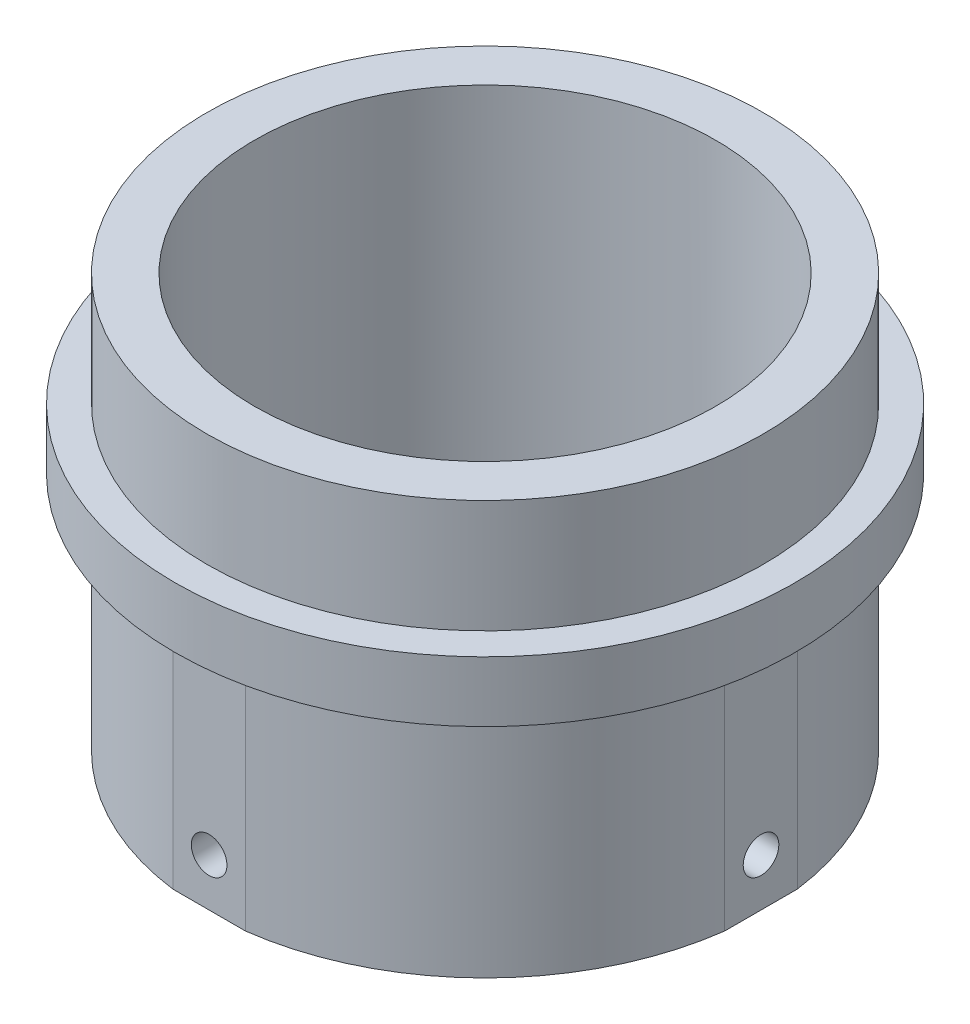
ISO-10303-21;
HEADER;
FILE_DESCRIPTION(('STEP AP214'),'2;1');
FILE_NAME('part.step','',(''),(''),'','','');
FILE_SCHEMA(('AUTOMOTIVE_DESIGN { 1 0 10303 214 1 1 1 1 }'));
ENDSEC;
DATA;
#1=APPLICATION_CONTEXT('core data for automotive mechanical design processes');
#2=APPLICATION_PROTOCOL_DEFINITION('international standard','automotive_design',2000,#1);
#3=PRODUCT_CONTEXT('',#1,'mechanical');
#4=PRODUCT('Part','Part','',(#3));
#5=PRODUCT_RELATED_PRODUCT_CATEGORY('part','',(#4));
#6=PRODUCT_DEFINITION_FORMATION('','',#4);
#7=PRODUCT_DEFINITION_CONTEXT('part definition',#1,'design');
#8=PRODUCT_DEFINITION('design','',#6,#7);
#9=PRODUCT_DEFINITION_SHAPE('','',#8);
#10=(LENGTH_UNIT() NAMED_UNIT(*) SI_UNIT(.MILLI.,.METRE.));
#11=(NAMED_UNIT(*) PLANE_ANGLE_UNIT() SI_UNIT($,.RADIAN.));
#12=(NAMED_UNIT(*) SI_UNIT($,.STERADIAN.) SOLID_ANGLE_UNIT());
#13=UNCERTAINTY_MEASURE_WITH_UNIT(LENGTH_MEASURE(1.E-05),#10,'distance_accuracy_value','');
#14=(GEOMETRIC_REPRESENTATION_CONTEXT(3) GLOBAL_UNCERTAINTY_ASSIGNED_CONTEXT((#13)) GLOBAL_UNIT_ASSIGNED_CONTEXT((#10,
#11,#12)) REPRESENTATION_CONTEXT('',''));
#15=CARTESIAN_POINT('',(0.,0.,0.));
#16=DIRECTION('',(0.,0.,1.));
#17=DIRECTION('',(1.,0.,0.));
#18=AXIS2_PLACEMENT_3D('',#15,#16,#17);
#19=CARTESIAN_POINT('',(0.,33.02,0.));
#20=DIRECTION('',(0.,-1.,0.));
#21=DIRECTION('',(0.,0.,-1.));
#22=AXIS2_PLACEMENT_3D('',#19,#20,#21);
#23=CYLINDRICAL_SURFACE('',#22,22.225);
#24=CARTESIAN_POINT('',(0.,19.177,0.));
#25=DIRECTION('',(0.,1.,0.));
#26=DIRECTION('',(0.,0.,1.));
#27=AXIS2_PLACEMENT_3D('',#24,#25,#26);
#28=CIRCLE('',#27,22.225);
#29=CARTESIAN_POINT('',(2.90369329475419,19.177,22.0345));
#30=VERTEX_POINT('',#29);
#31=CARTESIAN_POINT('',(22.0345,19.177,2.90369329475417));
#32=VERTEX_POINT('',#31);
#33=EDGE_CURVE('E101',#30,#32,#28,.T.);
#34=ORIENTED_EDGE('',*,*,#33,.F.);
#35=DIRECTION('',(0.,-1.,0.));
#36=VECTOR('',#35,1.);
#37=CARTESIAN_POINT('',(2.90369329475419,33.02,22.0345));
#38=LINE('',#37,#36);
#39=CARTESIAN_POINT('',(2.90369329475414,0.,22.0345));
#40=VERTEX_POINT('',#39);
#41=EDGE_CURVE('E104',#40,#30,#38,.F.);
#42=ORIENTED_EDGE('',*,*,#41,.F.);
#43=CARTESIAN_POINT('',(0.,0.,0.));
#44=DIRECTION('',(0.,1.,0.));
#45=DIRECTION('',(0.,0.,1.));
#46=AXIS2_PLACEMENT_3D('',#43,#44,#45);
#47=CIRCLE('',#46,22.225);
#48=CARTESIAN_POINT('',(22.0345,0.,2.90369329475415));
#49=VERTEX_POINT('',#48);
#50=EDGE_CURVE('E41',#40,#49,#47,.T.);
#51=ORIENTED_EDGE('',*,*,#50,.T.);
#52=DIRECTION('',(0.,-1.,0.));
#53=VECTOR('',#52,1.);
#54=CARTESIAN_POINT('',(22.0345,33.02,2.90369329475419));
#55=LINE('',#54,#53);
#56=EDGE_CURVE('E106',#32,#49,#55,.T.);
#57=ORIENTED_EDGE('',*,*,#56,.F.);
#58=EDGE_LOOP('',(#34,#42,#51,#57));
#59=FACE_BOUND('',#58,.T.);
#60=ADVANCED_FACE('F32',(#59),#23,.T.);
#61=CARTESIAN_POINT('',(22.0345,19.177,-2.90369329475417));
#62=VERTEX_POINT('',#61);
#63=CARTESIAN_POINT('',(2.90369329475417,19.177,-22.0345));
#64=VERTEX_POINT('',#63);
#65=EDGE_CURVE('E112',#62,#64,#28,.T.);
#66=ORIENTED_EDGE('',*,*,#65,.F.);
#67=DIRECTION('',(0.,-1.,0.));
#68=VECTOR('',#67,1.);
#69=CARTESIAN_POINT('',(22.0345,33.02,-2.90369329475419));
#70=LINE('',#69,#68);
#71=CARTESIAN_POINT('',(22.0345,0.,-2.90369329475415));
#72=VERTEX_POINT('',#71);
#73=EDGE_CURVE('E126',#72,#62,#70,.F.);
#74=ORIENTED_EDGE('',*,*,#73,.F.);
#75=CARTESIAN_POINT('',(2.90369329475415,0.,-22.0345));
#76=VERTEX_POINT('',#75);
#77=EDGE_CURVE('E167',#72,#76,#47,.T.);
#78=ORIENTED_EDGE('',*,*,#77,.T.);
#79=DIRECTION('',(0.,-1.,0.));
#80=VECTOR('',#79,1.);
#81=CARTESIAN_POINT('',(2.9036932947542,33.02,-22.0345));
#82=LINE('',#81,#80);
#83=EDGE_CURVE('E154',#64,#76,#82,.T.);
#84=ORIENTED_EDGE('',*,*,#83,.F.);
#85=EDGE_LOOP('',(#66,#74,#78,#84));
#86=FACE_BOUND('',#85,.T.);
#87=ADVANCED_FACE('F231',(#86),#23,.T.);
#88=CARTESIAN_POINT('',(-2.90369329475417,19.177,-22.0345));
#89=VERTEX_POINT('',#88);
#90=CARTESIAN_POINT('',(-22.0345,19.177,-2.90369329475417));
#91=VERTEX_POINT('',#90);
#92=EDGE_CURVE('E240',#89,#91,#28,.T.);
#93=ORIENTED_EDGE('',*,*,#92,.F.);
#94=DIRECTION('',(0.,-1.,0.));
#95=VECTOR('',#94,1.);
#96=CARTESIAN_POINT('',(-2.90369329475419,33.02,-22.0345));
#97=LINE('',#96,#95);
#98=CARTESIAN_POINT('',(-2.90369329475414,0.,-22.0345));
#99=VERTEX_POINT('',#98);
#100=EDGE_CURVE('E151',#99,#89,#97,.F.);
#101=ORIENTED_EDGE('',*,*,#100,.F.);
#102=CARTESIAN_POINT('',(-22.0345,0.,-2.90369329475415));
#103=VERTEX_POINT('',#102);
#104=EDGE_CURVE('E229',#99,#103,#47,.T.);
#105=ORIENTED_EDGE('',*,*,#104,.T.);
#106=DIRECTION('',(0.,-1.,0.));
#107=VECTOR('',#106,1.);
#108=CARTESIAN_POINT('',(-22.0345,33.02,-2.90369329475419));
#109=LINE('',#108,#107);
#110=EDGE_CURVE('E57',#91,#103,#109,.T.);
#111=ORIENTED_EDGE('',*,*,#110,.F.);
#112=EDGE_LOOP('',(#93,#101,#105,#111));
#113=FACE_BOUND('',#112,.T.);
#114=ADVANCED_FACE('F247',(#113),#23,.T.);
#115=CARTESIAN_POINT('',(-22.0345,19.177,2.90369329475417));
#116=VERTEX_POINT('',#115);
#117=CARTESIAN_POINT('',(-2.9036932947542,19.177,22.0345));
#118=VERTEX_POINT('',#117);
#119=EDGE_CURVE('E114',#116,#118,#28,.T.);
#120=ORIENTED_EDGE('',*,*,#119,.F.);
#121=DIRECTION('',(0.,-1.,0.));
#122=VECTOR('',#121,1.);
#123=CARTESIAN_POINT('',(-22.0345,33.02,2.90369329475419));
#124=LINE('',#123,#122);
#125=CARTESIAN_POINT('',(-22.0345,0.,2.90369329475415));
#126=VERTEX_POINT('',#125);
#127=EDGE_CURVE('E146',#126,#116,#124,.F.);
#128=ORIENTED_EDGE('',*,*,#127,.F.);
#129=CARTESIAN_POINT('',(-2.90369329475415,0.,22.0345));
#130=VERTEX_POINT('',#129);
#131=EDGE_CURVE('E161',#126,#130,#47,.T.);
#132=ORIENTED_EDGE('',*,*,#131,.T.);
#133=DIRECTION('',(0.,-1.,0.));
#134=VECTOR('',#133,1.);
#135=CARTESIAN_POINT('',(-2.9036932947542,33.02,22.0345));
#136=LINE('',#135,#134);
#137=EDGE_CURVE('E49',#118,#130,#136,.T.);
#138=ORIENTED_EDGE('',*,*,#137,.F.);
#139=EDGE_LOOP('',(#120,#128,#132,#138));
#140=FACE_BOUND('',#139,.T.);
#141=ADVANCED_FACE('F237',(#140),#23,.T.);
#142=CARTESIAN_POINT('',(0.,24.003,0.));
#143=DIRECTION('',(0.,1.,0.));
#144=DIRECTION('',(0.,0.,1.));
#145=AXIS2_PLACEMENT_3D('',#142,#143,#144);
#146=CIRCLE('',#145,22.225);
#147=CARTESIAN_POINT('',(0.,24.003,22.225));
#148=VERTEX_POINT('',#147);
#149=EDGE_CURVE('E111',#148,#148,#146,.T.);
#150=ORIENTED_EDGE('',*,*,#149,.T.);
#151=EDGE_LOOP('',(#150));
#152=FACE_BOUND('',#151,.T.);
#153=CARTESIAN_POINT('',(0.,33.02,0.));
#154=DIRECTION('',(0.,1.,0.));
#155=DIRECTION('',(0.,0.,1.));
#156=AXIS2_PLACEMENT_3D('',#153,#154,#155);
#157=CIRCLE('',#156,22.225);
#158=CARTESIAN_POINT('',(0.,33.02,22.225));
#159=VERTEX_POINT('',#158);
#160=EDGE_CURVE('E11',#159,#159,#157,.T.);
#161=ORIENTED_EDGE('',*,*,#160,.F.);
#162=EDGE_LOOP('',(#161));
#163=FACE_BOUND('',#162,.T.);
#164=ADVANCED_FACE('F34',(#152,#163),#23,.T.);
#165=CARTESIAN_POINT('',(0.,0.,0.));
#166=DIRECTION('',(0.,1.,0.));
#167=DIRECTION('',(0.,0.,1.));
#168=AXIS2_PLACEMENT_3D('',#165,#166,#167);
#169=PLANE('',#168);
#170=CARTESIAN_POINT('',(0.,0.,0.));
#171=DIRECTION('',(0.,1.,0.));
#172=DIRECTION('',(0.,0.,1.));
#173=AXIS2_PLACEMENT_3D('',#170,#171,#172);
#174=CIRCLE('',#173,18.415);
#175=CARTESIAN_POINT('',(0.,0.,18.415));
#176=VERTEX_POINT('',#175);
#177=EDGE_CURVE('E162',#176,#176,#174,.T.);
#178=ORIENTED_EDGE('',*,*,#177,.T.);
#179=EDGE_LOOP('',(#178));
#180=FACE_BOUND('',#179,.T.);
#181=DIRECTION('',(0.,0.,-1.));
#182=VECTOR('',#181,1.);
#183=CARTESIAN_POINT('',(-22.0345,0.,-22.0345));
#184=LINE('',#183,#182);
#185=EDGE_CURVE('E132',#126,#103,#184,.T.);
#186=ORIENTED_EDGE('',*,*,#185,.T.);
#187=ORIENTED_EDGE('',*,*,#104,.F.);
#188=DIRECTION('',(1.,0.,0.));
#189=VECTOR('',#188,1.);
#190=CARTESIAN_POINT('',(22.0345,0.,-22.0345));
#191=LINE('',#190,#189);
#192=EDGE_CURVE('E134',#99,#76,#191,.T.);
#193=ORIENTED_EDGE('',*,*,#192,.T.);
#194=ORIENTED_EDGE('',*,*,#77,.F.);
#195=DIRECTION('',(0.,0.,1.));
#196=VECTOR('',#195,1.);
#197=CARTESIAN_POINT('',(22.0345,0.,-22.0345));
#198=LINE('',#197,#196);
#199=EDGE_CURVE('E137',#72,#49,#198,.T.);
#200=ORIENTED_EDGE('',*,*,#199,.T.);
#201=ORIENTED_EDGE('',*,*,#50,.F.);
#202=DIRECTION('',(-1.,0.,0.));
#203=VECTOR('',#202,1.);
#204=CARTESIAN_POINT('',(22.0345,0.,22.0345));
#205=LINE('',#204,#203);
#206=EDGE_CURVE('E117',#40,#130,#205,.T.);
#207=ORIENTED_EDGE('',*,*,#206,.T.);
#208=ORIENTED_EDGE('',*,*,#131,.F.);
#209=EDGE_LOOP('',(#186,#187,#193,#194,#200,#201,#207,#208));
#210=FACE_BOUND('',#209,.T.);
#211=ADVANCED_FACE('F189',(#180,#210),#169,.F.);
#212=CARTESIAN_POINT('',(0.,3.81,43.18));
#213=DIRECTION('',(0.,0.,-1.));
#214=DIRECTION('',(-1.,0.,0.));
#215=AXIS2_PLACEMENT_3D('',#212,#213,#214);
#216=CYLINDRICAL_SURFACE('',#215,1.4224);
#217=CARTESIAN_POINT('',(-1.4224,3.81,18.3599837483588));
#218=CARTESIAN_POINT('',(-1.42239650681355,3.73023113459155,18.35998447961));
#219=CARTESIAN_POINT('',(-1.41566721976569,3.65040746469429,18.3605092022995));
#220=CARTESIAN_POINT('',(-1.38892106447783,3.49296729513801,18.3625514626492));
#221=CARTESIAN_POINT('',(-1.36888900820476,3.41535342420208,18.3640701350928));
#222=CARTESIAN_POINT('',(-1.31611884052771,3.26463599228246,18.3679272630427));
#223=CARTESIAN_POINT('',(-1.28338777263925,3.19152995702923,18.3702652640385));
#224=CARTESIAN_POINT('',(-1.20616087485778,3.05186749628802,18.3754970431409));
#225=CARTESIAN_POINT('',(-1.16166761755281,2.98530964296546,18.3783906996786));
#226=CARTESIAN_POINT('',(-1.06207204281324,2.86046686881619,18.3844149862797));
#227=CARTESIAN_POINT('',(-1.00694899697167,2.80219850497902,18.3875460719777));
#228=CARTESIAN_POINT('',(-0.887702199123555,2.69573083522692,18.3936882309961));
#229=CARTESIAN_POINT('',(-0.823578059883515,2.64753196273084,18.3966992991461));
#230=CARTESIAN_POINT('',(-0.688051891605246,2.56251742801623,18.4022663776143));
#231=CARTESIAN_POINT('',(-0.616640949387226,2.52571593439697,18.4048218198629));
#232=CARTESIAN_POINT('',(-0.468630543431606,2.46463145986177,18.4091848323384));
#233=CARTESIAN_POINT('',(-0.392031159152555,2.44034828728264,18.4109924140153));
#234=CARTESIAN_POINT('',(-0.235981761047581,2.40503699386494,18.4136528634299));
#235=CARTESIAN_POINT('',(-0.156537794976674,2.39398229298813,18.4145076453954));
#236=CARTESIAN_POINT('',(0.00308233241536438,2.38535960350556,18.4151726603184));
#237=CARTESIAN_POINT('',(0.0832584818234071,2.38779139585492,18.414982910241));
#238=CARTESIAN_POINT('',(0.241886905298073,2.40605086871976,18.4135818255302));
#239=CARTESIAN_POINT('',(0.320342491643396,2.42184996445918,18.4123726708215));
#240=CARTESIAN_POINT('',(0.473484864874059,2.46635114688757,18.4090713275997));
#241=CARTESIAN_POINT('',(0.548171620205863,2.49505334158438,18.4069791316949));
#242=CARTESIAN_POINT('',(0.691747472087647,2.56457799512987,18.4021433879079));
#243=CARTESIAN_POINT('',(0.760630321600572,2.60541330484426,18.3993991500319));
#244=CARTESIAN_POINT('',(0.890574837745808,2.69803568951046,18.3935678616803));
#245=CARTESIAN_POINT('',(0.951636368414656,2.74982295480631,18.3904808052469));
#246=CARTESIAN_POINT('',(1.06437197169305,2.86304041424669,18.3843014569731));
#247=CARTESIAN_POINT('',(1.11602111252135,2.92449543771333,18.3812091725137));
#248=CARTESIAN_POINT('',(1.20827331598365,3.05521725525148,18.3753760254579));
#249=CARTESIAN_POINT('',(1.24887637126222,3.1244840545247,18.3726351630954));
#250=CARTESIAN_POINT('',(1.3178826176913,3.26888016715358,18.3678145931863));
#251=CARTESIAN_POINT('',(1.34628459350678,3.34401006364504,18.3657349515085));
#252=CARTESIAN_POINT('',(1.39006439710553,3.49799170911758,18.3624734748677));
#253=CARTESIAN_POINT('',(1.40544245969007,3.57684339097349,18.3612916237191));
#254=CARTESIAN_POINT('',(1.4227065096175,3.73581235624515,18.3599620776445));
#255=CARTESIAN_POINT('',(1.42462722887299,3.81592584645773,18.3598117205675));
#256=CARTESIAN_POINT('',(1.41501297476957,3.97533580674621,18.3605551556612));
#257=CARTESIAN_POINT('',(1.4034781089956,4.05463228334949,18.3614489394833));
#258=CARTESIAN_POINT('',(1.3673090387285,4.21005805409689,18.364177516596));
#259=CARTESIAN_POINT('',(1.34269097430839,4.28619112627028,18.3660111503429));
#260=CARTESIAN_POINT('',(1.28107071090154,4.43324584747155,18.3704118468304));
#261=CARTESIAN_POINT('',(1.24406834081255,4.5041674244806,18.3729789197042));
#262=CARTESIAN_POINT('',(1.15864166095174,4.63894508415851,18.3785636959021));
#263=CARTESIAN_POINT('',(1.11019416539979,4.70278643261314,18.3815823093527));
#264=CARTESIAN_POINT('',(1.00328604980187,4.82144265548429,18.3877269224582));
#265=CARTESIAN_POINT('',(0.944825281467274,4.87625739620031,18.3908529237029));
#266=CARTESIAN_POINT('',(0.819400212243705,4.97542257088513,18.3968679678259));
#267=CARTESIAN_POINT('',(0.752418064576355,5.01975046785939,18.3997564918161));
#268=CARTESIAN_POINT('',(0.611940796135872,5.09652915173432,18.4049636525005));
#269=CARTESIAN_POINT('',(0.538445732527976,5.12898004286916,18.407282294196));
#270=CARTESIAN_POINT('',(0.387110316777364,5.18104468703538,18.4110860294673));
#271=CARTESIAN_POINT('',(0.309274819173709,5.20067248140924,18.4125720345288));
#272=CARTESIAN_POINT('',(0.151401128933423,5.22657968233437,18.4145467459462));
#273=CARTESIAN_POINT('',(0.0713629715564833,5.23285930243452,18.4150354682569));
#274=CARTESIAN_POINT('',(-0.0884216203845036,5.23188955907571,18.4149605817495));
#275=CARTESIAN_POINT('',(-0.168168272038826,5.22467536436163,18.4143997084762));
#276=CARTESIAN_POINT('',(-0.325313957645529,5.1969959812794,18.4122940786297));
#277=CARTESIAN_POINT('',(-0.402712988062591,5.17653077295738,18.4107493205749));
#278=CARTESIAN_POINT('',(-0.552969531289386,5.12293894364712,18.4068493371571));
#279=CARTESIAN_POINT('',(-0.62582721995756,5.08981281329382,18.4044941432003));
#280=CARTESIAN_POINT('',(-0.764952449259312,5.01184368019842,18.3992370795251));
#281=CARTESIAN_POINT('',(-0.831220115404544,4.96700090066725,18.3963352202214));
#282=CARTESIAN_POINT('',(-0.955463898009027,4.8667396705029,18.3903017597444));
#283=CARTESIAN_POINT('',(-1.01341908129818,4.81129531298266,18.3871696075945));
#284=CARTESIAN_POINT('',(-1.11922260308531,4.69144908972928,18.3810332238005));
#285=CARTESIAN_POINT('',(-1.16706848254594,4.62704505090236,18.3780290234216));
#286=CARTESIAN_POINT('',(-1.25135036997888,4.49099944783212,18.3724832216959));
#287=CARTESIAN_POINT('',(-1.2877672310005,4.41934600140765,18.3699423995942));
#288=CARTESIAN_POINT('',(-1.34800716001514,4.27097190660863,18.3656206611829));
#289=CARTESIAN_POINT('',(-1.37184479450424,4.19425723540773,18.3638388663977));
#290=CARTESIAN_POINT('',(-1.40013822045773,4.0659037034883,18.3616979890394));
#291=CARTESIAN_POINT('',(-1.40847538850035,4.01509176465998,18.3610580771666));
#292=CARTESIAN_POINT('',(-1.41960739839332,3.91286081363068,18.3602007215145));
#293=CARTESIAN_POINT('',(-1.42240225270609,3.86144180279502,18.3599832767854));
#294=CARTESIAN_POINT('',(-1.4224,3.81,18.3599837483588));
#295=B_SPLINE_CURVE_WITH_KNOTS('',3,(#217,#218,#219,#220,#221,#222,#223,#224,#225,#226,#227,
#228,#229,#230,#231,#232,#233,#234,#235,#236,#237,#238,#239,#240,#241,#242,#243,#244,#245,#246,
#247,#248,#249,#250,#251,#252,#253,#254,#255,#256,#257,#258,#259,#260,#261,#262,#263,#264,#265,
#266,#267,#268,#269,#270,#271,#272,#273,#274,#275,#276,#277,#278,#279,#280,#281,#282,#283,#284,
#285,#286,#287,#288,#289,#290,#291,#292,#293,#294),.UNSPECIFIED.,.T.,.F.,(4,2,2,2,2,2,2,2,2,2,2,
2,2,2,2,2,2,2,2,2,2,2,2,2,2,2,2,2,2,2,2,2,2,2,2,2,2,2,4),(0.,0.239118782158438,
0.478511041381392,0.717770710905918,0.956978093562213,1.19665674301657,1.43634570678035,
1.67633145368428,1.91631352614997,2.15581258732235,2.39530775861114,2.63429208164904,
2.87327840518791,3.11251876043804,3.35176327400661,3.59163257459823,3.83150203491485,
4.07139538280642,4.31128440569505,4.55055407276404,4.78982182675119,5.02879509120597,
5.26777165746519,5.5072365630995,5.74670501532593,5.98668352040625,6.22665991935319,
6.46637310077815,6.7060824471568,6.94516791271504,7.18425373829788,7.42333029978715,
7.66240230702126,7.90206617428451,8.14178827163478,8.38190985593974,8.62175277062241,
8.77595740714041,8.9301616969143),.UNSPECIFIED.);
#296=CARTESIAN_POINT('',(-1.4224,3.81,18.3599837483588));
#297=VERTEX_POINT('',#296);
#298=EDGE_CURVE('E168',#297,#297,#295,.T.);
#299=ORIENTED_EDGE('',*,*,#298,.F.);
#300=EDGE_LOOP('',(#299));
#301=FACE_BOUND('',#300,.T.);
#302=CARTESIAN_POINT('',(0.,3.81,22.0345));
#303=DIRECTION('',(0.,0.,1.));
#304=DIRECTION('',(1.,0.,0.));
#305=AXIS2_PLACEMENT_3D('',#302,#303,#304);
#306=CIRCLE('',#305,1.4224);
#307=CARTESIAN_POINT('',(1.4224,3.81,22.0345));
#308=VERTEX_POINT('',#307);
#309=EDGE_CURVE('E36',#308,#308,#306,.T.);
#310=ORIENTED_EDGE('',*,*,#309,.T.);
#311=EDGE_LOOP('',(#310));
#312=FACE_BOUND('',#311,.T.);
#313=ADVANCED_FACE('F184',(#301,#312),#216,.F.);
#314=CARTESIAN_POINT('',(0.,5.2324,-18.415));
#315=CARTESIAN_POINT('',(0.079769265670183,5.23239650717487,-18.4149992768214));
#316=CARTESIAN_POINT('',(0.159593334513902,5.2256671548785,-18.4144761575236));
#317=CARTESIAN_POINT('',(0.317034333004277,5.19892071684706,-18.4124396257413));
#318=CARTESIAN_POINT('',(0.394648634240625,5.17888844444777,-18.4109250814705));
#319=CARTESIAN_POINT('',(0.545366975877828,5.12611764448406,-18.407076910129));
#320=CARTESIAN_POINT('',(0.618473486903995,5.09338615014054,-18.4047437365088));
#321=CARTESIAN_POINT('',(0.758136744219959,5.01615824820884,-18.3995202048964));
#322=CARTESIAN_POINT('',(0.824694918942588,4.97166441426177,-18.3966299688288));
#323=CARTESIAN_POINT('',(0.949537327675537,4.87206825807139,-18.3906096663636));
#324=CARTESIAN_POINT('',(1.00780510709163,4.81694533614833,-18.387479141484));
#325=CARTESIAN_POINT('',(1.11427164961792,4.69769903118218,-18.3813349575124));
#326=CARTESIAN_POINT('',(1.16246997751785,4.63357525931487,-18.3783213034761));
#327=CARTESIAN_POINT('',(1.24748394469796,4.49804941043927,-18.3727470090641));
#328=CARTESIAN_POINT('',(1.28428531481542,4.42663835709678,-18.3701869382826));
#329=CARTESIAN_POINT('',(1.34536953033033,4.27862770954702,-18.3658146868665));
#330=CARTESIAN_POINT('',(1.36965256887147,4.20202819541246,-18.3640024946931));
#331=CARTESIAN_POINT('',(1.4049635793129,4.04597840983168,-18.3613348790882));
#332=CARTESIAN_POINT('',(1.41601812051501,3.96653418381303,-18.3604775380889));
#333=CARTESIAN_POINT('',(1.42464040059368,3.80691354819573,-18.3598105759478));
#334=CARTESIAN_POINT('',(1.42220836022101,3.72673715060285,-18.360000937657));
#335=CARTESIAN_POINT('',(1.40394849681943,3.56810982669967,-18.3614061354453));
#336=CARTESIAN_POINT('',(1.38814950817211,3.48965555895466,-18.3626187663264));
#337=CARTESIAN_POINT('',(1.34364899782897,3.33651576770772,-18.3659283997654));
#338=CARTESIAN_POINT('',(1.31494736572265,3.26183027646206,-18.3680254098911));
#339=CARTESIAN_POINT('',(1.24542387263419,3.1182559485861,-18.3728700488496));
#340=CARTESIAN_POINT('',(1.20458902879177,3.04937342313827,-18.3756183739658));
#341=CARTESIAN_POINT('',(1.11196763607319,2.91942935712147,-18.3814553020504));
#342=CARTESIAN_POINT('',(1.06018089711768,2.85836795232415,-18.3845439109242));
#343=CARTESIAN_POINT('',(0.946963808363313,2.74563174651247,-18.3907231868548));
#344=CARTESIAN_POINT('',(0.885508522460619,2.69398198378256,-18.3938138380644));
#345=CARTESIAN_POINT('',(0.754785959232194,2.60172865098595,-18.3996412051402));
#346=CARTESIAN_POINT('',(0.685518677600247,2.5611250870083,-18.4023779208113));
#347=CARTESIAN_POINT('',(0.541122439954809,2.49211847562865,-18.4071894709376));
#348=CARTESIAN_POINT('',(0.465992976654934,2.46371648548166,-18.4092642480326));
#349=CARTESIAN_POINT('',(0.312012271930564,2.41993652022416,-18.4125174556561));
#350=CARTESIAN_POINT('',(0.233161096888662,2.40455831290656,-18.4136959021658));
#351=CARTESIAN_POINT('',(0.0741923583750264,2.38729371792451,-18.4150216142314));
#352=CARTESIAN_POINT('',(-0.00592142684414351,2.38537273514898,-18.4151715238743));
#353=CARTESIAN_POINT('',(-0.16533204065434,2.3949865675319,-18.414430323687));
#354=CARTESIAN_POINT('',(-0.244628875772769,2.40652127509561,-18.4135392221809));
#355=CARTESIAN_POINT('',(-0.400056384229214,2.44269039582758,-18.4108179468935));
#356=CARTESIAN_POINT('',(-0.476190798666664,2.46730882605144,-18.4089889189692));
#357=CARTESIAN_POINT('',(-0.623248042317289,2.52893027117141,-18.404597353445));
#358=CARTESIAN_POINT('',(-0.694170800415973,2.56593345502266,-18.4020348058384));
#359=CARTESIAN_POINT('',(-0.828949250989163,2.65136132479489,-18.3964570838456));
#360=CARTESIAN_POINT('',(-0.892790340484276,2.69980898958106,-18.3934410033174));
#361=CARTESIAN_POINT('',(-1.01144596191247,2.80671729526664,-18.3872983055757));
#362=CARTESIAN_POINT('',(-1.06626035902624,2.86517808569175,-18.3841716867121));
#363=CARTESIAN_POINT('',(-1.16542481093598,2.99060300206489,-18.3781525236131));
#364=CARTESIAN_POINT('',(-1.2097523324711,3.0575849714334,-18.3752604920384));
#365=CARTESIAN_POINT('',(-1.28653035722479,3.19806178503782,-18.3700449596842));
#366=CARTESIAN_POINT('',(-1.31898096461401,3.27155657214374,-18.3677214539184));
#367=CARTESIAN_POINT('',(-1.37104541675742,3.42289217843935,-18.3639087584445));
#368=CARTESIAN_POINT('',(-1.390673179994,3.50072818550095,-18.3624186643682));
#369=CARTESIAN_POINT('',(-1.41658014594613,3.65860294860316,-18.3604383701137));
#370=CARTESIAN_POINT('',(-1.42285956491921,3.73864166893616,-18.3599481537364));
#371=CARTESIAN_POINT('',(-1.42188924319078,3.89842589991751,-18.3600233089485));
#372=CARTESIAN_POINT('',(-1.41467491223953,3.97817162929706,-18.3605859177587));
#373=CARTESIAN_POINT('',(-1.38699558151394,4.13531543682674,-18.3626974655877));
#374=CARTESIAN_POINT('',(-1.36653056014379,4.21271351115048,-18.364246406214));
#375=CARTESIAN_POINT('',(-1.31293945623939,4.36296816770446,-18.368155372484));
#376=CARTESIAN_POINT('',(-1.27981386875591,4.43582492737869,-18.3705153664137));
#377=CARTESIAN_POINT('',(-1.20184610832818,4.57494852582574,-18.3757805526126));
#378=CARTESIAN_POINT('',(-1.15700415757706,4.64121548953679,-18.3786857345424));
#379=CARTESIAN_POINT('',(-1.05674382964918,4.76545933534105,-18.3847229734294));
#380=CARTESIAN_POINT('',(-1.00129935669293,4.82341513221047,-18.387855578083));
#381=CARTESIAN_POINT('',(-0.881452651408993,4.92921983793809,-18.393989738219));
#382=CARTESIAN_POINT('',(-0.817048247340197,4.97706628935274,-18.3969912616971));
#383=CARTESIAN_POINT('',(-0.681002356095281,5.06134878166766,-18.4025297187673));
#384=CARTESIAN_POINT('',(-0.60934905210392,5.09776578118259,-18.4050658741712));
#385=CARTESIAN_POINT('',(-0.460975261292935,5.15800600876764,-18.4093783823736));
#386=CARTESIAN_POINT('',(-0.384260750787909,5.18184380130877,-18.4111556134137));
#387=CARTESIAN_POINT('',(-0.255906794806871,5.21013767964626,-18.4132907177239));
#388=CARTESIAN_POINT('',(-0.205094239219609,5.21847505116115,-18.4139288029928));
#389=CARTESIAN_POINT('',(-0.102862052098104,5.22960733141506,-18.4147836768475));
#390=CARTESIAN_POINT('',(-0.0514424219151734,5.23240225248888,-18.4150004663708));
#391=CARTESIAN_POINT('',(0.,5.2324,-18.415));
#392=B_SPLINE_CURVE_WITH_KNOTS('',3,(#314,#315,#316,#317,#318,#319,#320,#321,#322,#323,#324,
#325,#326,#327,#328,#329,#330,#331,#332,#333,#334,#335,#336,#337,#338,#339,#340,#341,#342,#343,
#344,#345,#346,#347,#348,#349,#350,#351,#352,#353,#354,#355,#356,#357,#358,#359,#360,#361,#362,
#363,#364,#365,#366,#367,#368,#369,#370,#371,#372,#373,#374,#375,#376,#377,#378,#379,#380,#381,
#382,#383,#384,#385,#386,#387,#388,#389,#390,#391),.UNSPECIFIED.,.T.,.F.,(4,2,2,2,2,2,2,2,2,2,2,
2,2,2,2,2,2,2,2,2,2,2,2,2,2,2,2,2,2,2,2,2,2,2,2,2,2,2,4),(0.,0.239119984341714,
0.478513419326219,0.717774459665111,0.956983192117747,1.19666026864117,1.43634770206977,
1.67633402575237,1.91631664660671,2.1558164514475,2.39531233612436,2.63429290793643,
2.87327552479219,3.11251478601091,3.35175819976867,3.59162907783054,3.83150008811735,
4.07139187881382,4.31127939227806,4.55054998873371,4.78981867194095,5.02879573650551,
5.26777606137285,5.50724036506742,5.74670824498729,5.98668609130349,6.2266618327591,
6.4663766592268,6.70608760202677,6.94517038748361,7.18425356259553,7.42332739008409,
7.66239668402385,7.90206214959617,8.14178580770595,8.38190674936738,8.62174906054022,
8.77595555091583,8.93016169810184),.UNSPECIFIED.);
#393=CARTESIAN_POINT('',(0.,5.2324,-18.415));
#394=VERTEX_POINT('',#393);
#395=EDGE_CURVE('E164',#394,#394,#392,.T.);
#396=ORIENTED_EDGE('',*,*,#395,.F.);
#397=EDGE_LOOP('',(#396));
#398=FACE_BOUND('',#397,.T.);
#399=CARTESIAN_POINT('',(0.,3.81,-22.0345));
#400=DIRECTION('',(0.,0.,-1.));
#401=DIRECTION('',(-1.,0.,0.));
#402=AXIS2_PLACEMENT_3D('',#399,#400,#401);
#403=CIRCLE('',#402,1.4224);
#404=CARTESIAN_POINT('',(-1.4224,3.81,-22.0345));
#405=VERTEX_POINT('',#404);
#406=EDGE_CURVE('E150',#405,#405,#403,.T.);
#407=ORIENTED_EDGE('',*,*,#406,.T.);
#408=EDGE_LOOP('',(#407));
#409=FACE_BOUND('',#408,.T.);
#410=ADVANCED_FACE('F188',(#398,#409),#216,.F.);
#411=CARTESIAN_POINT('',(43.18,3.81,0.));
#412=DIRECTION('',(-1.,0.,0.));
#413=DIRECTION('',(0.,0.,1.));
#414=AXIS2_PLACEMENT_3D('',#411,#412,#413);
#415=CYLINDRICAL_SURFACE('',#414,1.4224);
#416=CARTESIAN_POINT('',(-18.3599837483588,3.81,1.4224));
#417=CARTESIAN_POINT('',(-18.35998447961,3.88976886540845,1.42239650681355));
#418=CARTESIAN_POINT('',(-18.3605092022995,3.96959253530571,1.41566721976569));
#419=CARTESIAN_POINT('',(-18.3625514626492,4.12703270486199,1.38892106447783));
#420=CARTESIAN_POINT('',(-18.3640701350928,4.20464657579792,1.36888900820476));
#421=CARTESIAN_POINT('',(-18.3679272630427,4.35536400771754,1.31611884052771));
#422=CARTESIAN_POINT('',(-18.3702652640385,4.42847004297077,1.28338777263925));
#423=CARTESIAN_POINT('',(-18.3754970431409,4.56813250371198,1.20616087485778));
#424=CARTESIAN_POINT('',(-18.3783906996786,4.63469035703454,1.16166761755281));
#425=CARTESIAN_POINT('',(-18.3844149862797,4.75953313118381,1.06207204281324));
#426=CARTESIAN_POINT('',(-18.3875460719777,4.81780149502098,1.00694899697167));
#427=CARTESIAN_POINT('',(-18.3936882309961,4.92426916477308,0.887702199123555));
#428=CARTESIAN_POINT('',(-18.3966992991461,4.97246803726916,0.823578059883514));
#429=CARTESIAN_POINT('',(-18.4022663776143,5.05748257198377,0.688051891605246));
#430=CARTESIAN_POINT('',(-18.4048218198629,5.09428406560302,0.616640949387226));
#431=CARTESIAN_POINT('',(-18.4091848323384,5.15536854013823,0.468630543431606));
#432=CARTESIAN_POINT('',(-18.4109924140153,5.17965171271736,0.392031159152555));
#433=CARTESIAN_POINT('',(-18.4136528634299,5.21496300613506,0.235981761047581));
#434=CARTESIAN_POINT('',(-18.4145076453954,5.22601770701186,0.156537794976674));
#435=CARTESIAN_POINT('',(-18.4151726603184,5.23464039649444,-0.00308233241536477));
#436=CARTESIAN_POINT('',(-18.414982910241,5.23220860414508,-0.0832584818234076));
#437=CARTESIAN_POINT('',(-18.4135818255302,5.21394913128024,-0.241886905298074));
#438=CARTESIAN_POINT('',(-18.4123726708215,5.19815003554082,-0.320342491643396));
#439=CARTESIAN_POINT('',(-18.4090713275997,5.15364885311243,-0.47348486487406));
#440=CARTESIAN_POINT('',(-18.4069791316949,5.12494665841561,-0.548171620205863));
#441=CARTESIAN_POINT('',(-18.4021433879079,5.05542200487013,-0.691747472087648));
#442=CARTESIAN_POINT('',(-18.3993991500319,5.01458669515574,-0.760630321600572));
#443=CARTESIAN_POINT('',(-18.3935678616803,4.92196431048954,-0.890574837745809));
#444=CARTESIAN_POINT('',(-18.3904808052469,4.87017704519369,-0.951636368414656));
#445=CARTESIAN_POINT('',(-18.3843014569731,4.75695958575331,-1.06437197169305));
#446=CARTESIAN_POINT('',(-18.3812091725137,4.69550456228667,-1.11602111252135));
#447=CARTESIAN_POINT('',(-18.3753760254579,4.56478274474852,-1.20827331598365));
#448=CARTESIAN_POINT('',(-18.3726351630954,4.4955159454753,-1.24887637126222));
#449=CARTESIAN_POINT('',(-18.3678145931863,4.35111983284642,-1.3178826176913));
#450=CARTESIAN_POINT('',(-18.3657349515085,4.27598993635496,-1.34628459350678));
#451=CARTESIAN_POINT('',(-18.3624734748677,4.12200829088242,-1.39006439710553));
#452=CARTESIAN_POINT('',(-18.3612916237191,4.04315660902651,-1.40544245969007));
#453=CARTESIAN_POINT('',(-18.3599620776445,3.88418764375484,-1.4227065096175));
#454=CARTESIAN_POINT('',(-18.3598117205675,3.80407415354227,-1.42462722887299));
#455=CARTESIAN_POINT('',(-18.3605551556612,3.64466419325379,-1.41501297476957));
#456=CARTESIAN_POINT('',(-18.3614489394833,3.5653677166505,-1.4034781089956));
#457=CARTESIAN_POINT('',(-18.364177516596,3.40994194590311,-1.3673090387285));
#458=CARTESIAN_POINT('',(-18.3660111503429,3.33380887372972,-1.34269097430839));
#459=CARTESIAN_POINT('',(-18.3704118468304,3.18675415252845,-1.28107071090154));
#460=CARTESIAN_POINT('',(-18.3729789197042,3.11583257551939,-1.24406834081255));
#461=CARTESIAN_POINT('',(-18.3785636959021,2.98105491584149,-1.15864166095174));
#462=CARTESIAN_POINT('',(-18.3815823093527,2.91721356738686,-1.11019416539978));
#463=CARTESIAN_POINT('',(-18.3877269224582,2.79855734451571,-1.00328604980187));
#464=CARTESIAN_POINT('',(-18.3908529237029,2.74374260379969,-0.944825281467273));
#465=CARTESIAN_POINT('',(-18.3968679678259,2.64457742911487,-0.819400212243704));
#466=CARTESIAN_POINT('',(-18.3997564918161,2.60024953214061,-0.752418064576354));
#467=CARTESIAN_POINT('',(-18.4049636525005,2.52347084826568,-0.611940796135871));
#468=CARTESIAN_POINT('',(-18.407282294196,2.49101995713084,-0.538445732527976));
#469=CARTESIAN_POINT('',(-18.4110860294673,2.43895531296461,-0.387110316777363));
#470=CARTESIAN_POINT('',(-18.4125720345288,2.41932751859076,-0.309274819173709));
#471=CARTESIAN_POINT('',(-18.4145467459462,2.39342031766563,-0.151401128933422));
#472=CARTESIAN_POINT('',(-18.4150354682569,2.38714069756548,-0.0713629715564827));
#473=CARTESIAN_POINT('',(-18.4149605817495,2.38811044092429,0.0884216203845039));
#474=CARTESIAN_POINT('',(-18.4143997084762,2.39532463563837,0.168168272038826));
#475=CARTESIAN_POINT('',(-18.4122940786297,2.4230040187206,0.325313957645529));
#476=CARTESIAN_POINT('',(-18.4107493205749,2.44346922704262,0.402712988062592));
#477=CARTESIAN_POINT('',(-18.4068493371571,2.49706105635288,0.552969531289387));
#478=CARTESIAN_POINT('',(-18.4044941432003,2.53018718670618,0.625827219957561));
#479=CARTESIAN_POINT('',(-18.3992370795251,2.60815631980158,0.764952449259312));
#480=CARTESIAN_POINT('',(-18.3963352202214,2.65299909933275,0.831220115404545));
#481=CARTESIAN_POINT('',(-18.3903017597444,2.75326032949709,0.955463898009027));
#482=CARTESIAN_POINT('',(-18.3871696075945,2.80870468701734,1.01341908129818));
#483=CARTESIAN_POINT('',(-18.3810332238005,2.92855091027072,1.11922260308531));
#484=CARTESIAN_POINT('',(-18.3780290234216,2.99295494909764,1.16706848254594));
#485=CARTESIAN_POINT('',(-18.3724832216959,3.12900055216788,1.25135036997888));
#486=CARTESIAN_POINT('',(-18.3699423995942,3.20065399859235,1.2877672310005));
#487=CARTESIAN_POINT('',(-18.3656206611829,3.34902809339137,1.34800716001514));
#488=CARTESIAN_POINT('',(-18.3638388663977,3.42574276459227,1.37184479450424));
#489=CARTESIAN_POINT('',(-18.3616979890394,3.5540962965117,1.40013822045773));
#490=CARTESIAN_POINT('',(-18.3610580771666,3.60490823534002,1.40847538850035));
#491=CARTESIAN_POINT('',(-18.3602007215145,3.70713918636932,1.41960739839332));
#492=CARTESIAN_POINT('',(-18.3599832767854,3.75855819720498,1.42240225270609));
#493=CARTESIAN_POINT('',(-18.3599837483588,3.81,1.4224));
#494=B_SPLINE_CURVE_WITH_KNOTS('',3,(#416,#417,#418,#419,#420,#421,#422,#423,#424,#425,#426,
#427,#428,#429,#430,#431,#432,#433,#434,#435,#436,#437,#438,#439,#440,#441,#442,#443,#444,#445,
#446,#447,#448,#449,#450,#451,#452,#453,#454,#455,#456,#457,#458,#459,#460,#461,#462,#463,#464,
#465,#466,#467,#468,#469,#470,#471,#472,#473,#474,#475,#476,#477,#478,#479,#480,#481,#482,#483,
#484,#485,#486,#487,#488,#489,#490,#491,#492,#493),.UNSPECIFIED.,.T.,.F.,(4,2,2,2,2,2,2,2,2,2,2,
2,2,2,2,2,2,2,2,2,2,2,2,2,2,2,2,2,2,2,2,2,2,2,2,2,2,2,4),(0.,0.239118782158438,
0.478511041381392,0.717770710905918,0.956978093562214,1.19665674301657,1.43634570678035,
1.67633145368428,1.91631352614997,2.15581258732235,2.39530775861114,2.63429208164904,
2.87327840518791,3.11251876043804,3.35176327400661,3.59163257459823,3.83150203491485,
4.07139538280642,4.31128440569505,4.55055407276404,4.78982182675119,5.02879509120597,
5.26777165746519,5.5072365630995,5.74670501532593,5.98668352040625,6.22665991935319,
6.46637310077815,6.7060824471568,6.94516791271504,7.18425373829788,7.42333029978715,
7.66240230702127,7.90206617428451,8.14178827163478,8.38190985593974,8.6217527706224,
8.77595740714041,8.9301616969143),.UNSPECIFIED.);
#495=CARTESIAN_POINT('',(-18.3599837483588,3.81,1.4224));
#496=VERTEX_POINT('',#495);
#497=EDGE_CURVE('E157',#496,#496,#494,.T.);
#498=ORIENTED_EDGE('',*,*,#497,.F.);
#499=EDGE_LOOP('',(#498));
#500=FACE_BOUND('',#499,.T.);
#501=CARTESIAN_POINT('',(-22.0345,3.81,0.));
#502=DIRECTION('',(-1.,0.,0.));
#503=DIRECTION('',(0.,0.,1.));
#504=AXIS2_PLACEMENT_3D('',#501,#502,#503);
#505=CIRCLE('',#504,1.4224);
#506=CARTESIAN_POINT('',(-22.0345,3.81,1.4224));
#507=VERTEX_POINT('',#506);
#508=EDGE_CURVE('E145',#507,#507,#505,.T.);
#509=ORIENTED_EDGE('',*,*,#508,.T.);
#510=EDGE_LOOP('',(#509));
#511=FACE_BOUND('',#510,.T.);
#512=ADVANCED_FACE('F191',(#500,#511),#415,.F.);
#513=CARTESIAN_POINT('',(18.3599837483588,3.81,1.4224));
#514=CARTESIAN_POINT('',(18.35998447961,3.73023113459155,1.42239650681355));
#515=CARTESIAN_POINT('',(18.3605092022995,3.65040746469429,1.41566721976569));
#516=CARTESIAN_POINT('',(18.3625514626492,3.49296729513801,1.38892106447783));
#517=CARTESIAN_POINT('',(18.3640701350928,3.41535342420208,1.36888900820476));
#518=CARTESIAN_POINT('',(18.3679272630427,3.26463599228246,1.31611884052771));
#519=CARTESIAN_POINT('',(18.3702652640385,3.19152995702923,1.28338777263925));
#520=CARTESIAN_POINT('',(18.3754970431409,3.05186749628802,1.20616087485778));
#521=CARTESIAN_POINT('',(18.3783906996786,2.98530964296546,1.16166761755281));
#522=CARTESIAN_POINT('',(18.3844149862797,2.86046686881619,1.06207204281324));
#523=CARTESIAN_POINT('',(18.3875460719777,2.80219850497902,1.00694899697167));
#524=CARTESIAN_POINT('',(18.3936882309961,2.69573083522692,0.887702199123555));
#525=CARTESIAN_POINT('',(18.3966992991461,2.64753196273083,0.823578059883515));
#526=CARTESIAN_POINT('',(18.4022663776143,2.56251742801623,0.688051891605246));
#527=CARTESIAN_POINT('',(18.4048218198629,2.52571593439697,0.616640949387226));
#528=CARTESIAN_POINT('',(18.4091848323384,2.46463145986177,0.468630543431606));
#529=CARTESIAN_POINT('',(18.4109924140153,2.44034828728264,0.392031159152555));
#530=CARTESIAN_POINT('',(18.4136528634299,2.40503699386494,0.235981761047581));
#531=CARTESIAN_POINT('',(18.4145076453954,2.39398229298813,0.156537794976674));
#532=CARTESIAN_POINT('',(18.4151726603184,2.38535960350556,-0.00308233241536472));
#533=CARTESIAN_POINT('',(18.414982910241,2.38779139585492,-0.0832584818234074));
#534=CARTESIAN_POINT('',(18.4135818255302,2.40605086871976,-0.241886905298074));
#535=CARTESIAN_POINT('',(18.4123726708215,2.42184996445918,-0.320342491643396));
#536=CARTESIAN_POINT('',(18.4090713275997,2.46635114688757,-0.47348486487406));
#537=CARTESIAN_POINT('',(18.4069791316949,2.49505334158438,-0.548171620205863));
#538=CARTESIAN_POINT('',(18.4021433879079,2.56457799512987,-0.691747472087648));
#539=CARTESIAN_POINT('',(18.3993991500319,2.60541330484426,-0.760630321600572));
#540=CARTESIAN_POINT('',(18.3935678616803,2.69803568951046,-0.890574837745809));
#541=CARTESIAN_POINT('',(18.3904808052469,2.74982295480631,-0.951636368414656));
#542=CARTESIAN_POINT('',(18.3843014569731,2.86304041424669,-1.06437197169305));
#543=CARTESIAN_POINT('',(18.3812091725137,2.92449543771333,-1.11602111252135));
#544=CARTESIAN_POINT('',(18.3753760254579,3.05521725525148,-1.20827331598365));
#545=CARTESIAN_POINT('',(18.3726351630954,3.1244840545247,-1.24887637126222));
#546=CARTESIAN_POINT('',(18.3678145931863,3.26888016715358,-1.3178826176913));
#547=CARTESIAN_POINT('',(18.3657349515085,3.34401006364504,-1.34628459350678));
#548=CARTESIAN_POINT('',(18.3624734748677,3.49799170911758,-1.39006439710553));
#549=CARTESIAN_POINT('',(18.3612916237191,3.57684339097349,-1.40544245969007));
#550=CARTESIAN_POINT('',(18.3599620776445,3.73581235624516,-1.4227065096175));
#551=CARTESIAN_POINT('',(18.3598117205675,3.81592584645773,-1.42462722887299));
#552=CARTESIAN_POINT('',(18.3605551556612,3.97533580674621,-1.41501297476957));
#553=CARTESIAN_POINT('',(18.3614489394833,4.05463228334949,-1.4034781089956));
#554=CARTESIAN_POINT('',(18.364177516596,4.21005805409689,-1.3673090387285));
#555=CARTESIAN_POINT('',(18.3660111503429,4.28619112627028,-1.34269097430839));
#556=CARTESIAN_POINT('',(18.3704118468304,4.43324584747155,-1.28107071090154));
#557=CARTESIAN_POINT('',(18.3729789197042,4.50416742448061,-1.24406834081255));
#558=CARTESIAN_POINT('',(18.3785636959021,4.63894508415851,-1.15864166095174));
#559=CARTESIAN_POINT('',(18.3815823093527,4.70278643261314,-1.11019416539978));
#560=CARTESIAN_POINT('',(18.3877269224582,4.82144265548429,-1.00328604980187));
#561=CARTESIAN_POINT('',(18.3908529237029,4.87625739620031,-0.944825281467273));
#562=CARTESIAN_POINT('',(18.3968679678259,4.97542257088513,-0.819400212243704));
#563=CARTESIAN_POINT('',(18.3997564918161,5.01975046785939,-0.752418064576354));
#564=CARTESIAN_POINT('',(18.4049636525005,5.09652915173432,-0.611940796135871));
#565=CARTESIAN_POINT('',(18.407282294196,5.12898004286916,-0.538445732527975));
#566=CARTESIAN_POINT('',(18.4110860294673,5.18104468703538,-0.387110316777363));
#567=CARTESIAN_POINT('',(18.4125720345288,5.20067248140924,-0.309274819173709));
#568=CARTESIAN_POINT('',(18.4145467459462,5.22657968233437,-0.151401128933422));
#569=CARTESIAN_POINT('',(18.4150354682569,5.23285930243452,-0.0713629715564825));
#570=CARTESIAN_POINT('',(18.4149605817495,5.23188955907571,0.0884216203845045));
#571=CARTESIAN_POINT('',(18.4143997084762,5.22467536436163,0.168168272038827));
#572=CARTESIAN_POINT('',(18.4122940786297,5.1969959812794,0.32531395764553));
#573=CARTESIAN_POINT('',(18.4107493205749,5.17653077295738,0.402712988062592));
#574=CARTESIAN_POINT('',(18.4068493371571,5.12293894364712,0.552969531289387));
#575=CARTESIAN_POINT('',(18.4044941432003,5.08981281329382,0.625827219957561));
#576=CARTESIAN_POINT('',(18.3992370795251,5.01184368019842,0.764952449259312));
#577=CARTESIAN_POINT('',(18.3963352202214,4.96700090066725,0.831220115404545));
#578=CARTESIAN_POINT('',(18.3903017597444,4.8667396705029,0.955463898009028));
#579=CARTESIAN_POINT('',(18.3871696075945,4.81129531298266,1.01341908129818));
#580=CARTESIAN_POINT('',(18.3810332238005,4.69144908972928,1.11922260308531));
#581=CARTESIAN_POINT('',(18.3780290234216,4.62704505090236,1.16706848254594));
#582=CARTESIAN_POINT('',(18.3724832216959,4.49099944783211,1.25135036997888));
#583=CARTESIAN_POINT('',(18.3699423995942,4.41934600140765,1.2877672310005));
#584=CARTESIAN_POINT('',(18.3656206611829,4.27097190660863,1.34800716001514));
#585=CARTESIAN_POINT('',(18.3638388663977,4.19425723540773,1.37184479450424));
#586=CARTESIAN_POINT('',(18.3616979890394,4.0659037034883,1.40013822045773));
#587=CARTESIAN_POINT('',(18.3610580771666,4.01509176465998,1.40847538850035));
#588=CARTESIAN_POINT('',(18.3602007215145,3.91286081363068,1.41960739839332));
#589=CARTESIAN_POINT('',(18.3599832767854,3.86144180279502,1.42240225270609));
#590=CARTESIAN_POINT('',(18.3599837483588,3.81,1.4224));
#591=B_SPLINE_CURVE_WITH_KNOTS('',3,(#513,#514,#515,#516,#517,#518,#519,#520,#521,#522,#523,
#524,#525,#526,#527,#528,#529,#530,#531,#532,#533,#534,#535,#536,#537,#538,#539,#540,#541,#542,
#543,#544,#545,#546,#547,#548,#549,#550,#551,#552,#553,#554,#555,#556,#557,#558,#559,#560,#561,
#562,#563,#564,#565,#566,#567,#568,#569,#570,#571,#572,#573,#574,#575,#576,#577,#578,#579,#580,
#581,#582,#583,#584,#585,#586,#587,#588,#589,#590),.UNSPECIFIED.,.T.,.F.,(4,2,2,2,2,2,2,2,2,2,2,
2,2,2,2,2,2,2,2,2,2,2,2,2,2,2,2,2,2,2,2,2,2,2,2,2,2,2,4),(0.,0.239118782158438,
0.478511041381392,0.717770710905918,0.956978093562213,1.19665674301657,1.43634570678035,
1.67633145368428,1.91631352614997,2.15581258732235,2.39530775861114,2.63429208164904,
2.87327840518791,3.11251876043804,3.35176327400661,3.59163257459823,3.83150203491485,
4.07139538280642,4.31128440569505,4.55055407276404,4.78982182675119,5.02879509120597,
5.26777165746519,5.5072365630995,5.74670501532593,5.98668352040625,6.22665991935319,
6.46637310077815,6.70608244715679,6.94516791271504,7.18425373829788,7.42333029978715,
7.66240230702126,7.90206617428451,8.14178827163478,8.38190985593974,8.6217527706224,
8.77595740714041,8.9301616969143),.UNSPECIFIED.);
#592=CARTESIAN_POINT('',(18.3599837483588,3.81,1.4224));
#593=VERTEX_POINT('',#592);
#594=EDGE_CURVE('E176',#593,#593,#591,.T.);
#595=ORIENTED_EDGE('',*,*,#594,.F.);
#596=EDGE_LOOP('',(#595));
#597=FACE_BOUND('',#596,.T.);
#598=CARTESIAN_POINT('',(22.0345,3.81,0.));
#599=DIRECTION('',(1.,0.,0.));
#600=DIRECTION('',(0.,0.,-1.));
#601=AXIS2_PLACEMENT_3D('',#598,#599,#600);
#602=CIRCLE('',#601,1.4224);
#603=CARTESIAN_POINT('',(22.0345,3.81,-1.4224));
#604=VERTEX_POINT('',#603);
#605=EDGE_CURVE('E122',#604,#604,#602,.T.);
#606=ORIENTED_EDGE('',*,*,#605,.T.);
#607=EDGE_LOOP('',(#606));
#608=FACE_BOUND('',#607,.T.);
#609=ADVANCED_FACE('F196',(#597,#608),#415,.F.);
#610=CARTESIAN_POINT('',(0.,33.02,0.));
#611=DIRECTION('',(0.,-1.,0.));
#612=DIRECTION('',(0.,0.,-1.));
#613=AXIS2_PLACEMENT_3D('',#610,#611,#612);
#614=CYLINDRICAL_SURFACE('',#613,18.415);
#615=CARTESIAN_POINT('',(0.,33.02,0.));
#616=DIRECTION('',(0.,1.,0.));
#617=DIRECTION('',(0.,0.,1.));
#618=AXIS2_PLACEMENT_3D('',#615,#616,#617);
#619=CIRCLE('',#618,18.415);
#620=CARTESIAN_POINT('',(0.,33.02,18.415));
#621=VERTEX_POINT('',#620);
#622=EDGE_CURVE('E158',#621,#621,#619,.T.);
#623=ORIENTED_EDGE('',*,*,#622,.T.);
#624=EDGE_LOOP('',(#623));
#625=FACE_BOUND('',#624,.T.);
#626=ORIENTED_EDGE('',*,*,#497,.T.);
#627=EDGE_LOOP('',(#626));
#628=FACE_BOUND('',#627,.T.);
#629=ORIENTED_EDGE('',*,*,#298,.T.);
#630=EDGE_LOOP('',(#629));
#631=FACE_BOUND('',#630,.T.);
#632=ORIENTED_EDGE('',*,*,#177,.F.);
#633=EDGE_LOOP('',(#632));
#634=FACE_BOUND('',#633,.T.);
#635=ORIENTED_EDGE('',*,*,#395,.T.);
#636=EDGE_LOOP('',(#635));
#637=FACE_BOUND('',#636,.T.);
#638=ORIENTED_EDGE('',*,*,#594,.T.);
#639=EDGE_LOOP('',(#638));
#640=FACE_BOUND('',#639,.T.);
#641=ADVANCED_FACE('F181',(#625,#628,#631,#634,#637,#640),#614,.F.);
#642=CARTESIAN_POINT('',(0.,33.02,0.));
#643=DIRECTION('',(0.,1.,0.));
#644=DIRECTION('',(0.,0.,1.));
#645=AXIS2_PLACEMENT_3D('',#642,#643,#644);
#646=PLANE('',#645);
#647=ORIENTED_EDGE('',*,*,#160,.T.);
#648=EDGE_LOOP('',(#647));
#649=FACE_BOUND('',#648,.T.);
#650=ORIENTED_EDGE('',*,*,#622,.F.);
#651=EDGE_LOOP('',(#650));
#652=FACE_BOUND('',#651,.T.);
#653=ADVANCED_FACE('F266',(#649,#652),#646,.T.);
#654=CARTESIAN_POINT('',(22.0345,19.177,-22.0345));
#655=DIRECTION('',(1.,0.,0.));
#656=DIRECTION('',(0.,0.,-1.));
#657=AXIS2_PLACEMENT_3D('',#654,#655,#656);
#658=PLANE('',#657);
#659=ORIENTED_EDGE('',*,*,#605,.F.);
#660=EDGE_LOOP('',(#659));
#661=FACE_BOUND('',#660,.T.);
#662=ORIENTED_EDGE('',*,*,#56,.T.);
#663=ORIENTED_EDGE('',*,*,#199,.F.);
#664=ORIENTED_EDGE('',*,*,#73,.T.);
#665=DIRECTION('',(0.,0.,1.));
#666=VECTOR('',#665,1.);
#667=CARTESIAN_POINT('',(22.0345,19.177,-22.0345));
#668=LINE('',#667,#666);
#669=EDGE_CURVE('E123',#62,#32,#668,.T.);
#670=ORIENTED_EDGE('',*,*,#669,.T.);
#671=EDGE_LOOP('',(#662,#663,#664,#670));
#672=FACE_BOUND('',#671,.T.);
#673=ADVANCED_FACE('F239',(#661,#672),#658,.T.);
#674=CARTESIAN_POINT('',(0.,19.177,0.));
#675=DIRECTION('',(0.,-1.,0.));
#676=DIRECTION('',(0.,0.,-1.));
#677=AXIS2_PLACEMENT_3D('',#674,#675,#676);
#678=PLANE('',#677);
#679=ORIENTED_EDGE('',*,*,#669,.F.);
#680=ORIENTED_EDGE('',*,*,#65,.T.);
#681=DIRECTION('',(1.,0.,0.));
#682=VECTOR('',#681,1.);
#683=CARTESIAN_POINT('',(22.0345,19.177,-22.0345));
#684=LINE('',#683,#682);
#685=EDGE_CURVE('E128',#89,#64,#684,.T.);
#686=ORIENTED_EDGE('',*,*,#685,.F.);
#687=ORIENTED_EDGE('',*,*,#92,.T.);
#688=DIRECTION('',(0.,0.,-1.));
#689=VECTOR('',#688,1.);
#690=CARTESIAN_POINT('',(-22.0345,19.177,-22.0345));
#691=LINE('',#690,#689);
#692=EDGE_CURVE('E141',#116,#91,#691,.T.);
#693=ORIENTED_EDGE('',*,*,#692,.F.);
#694=ORIENTED_EDGE('',*,*,#119,.T.);
#695=DIRECTION('',(-1.,0.,0.));
#696=VECTOR('',#695,1.);
#697=CARTESIAN_POINT('',(22.0345,19.177,22.0345));
#698=LINE('',#697,#696);
#699=EDGE_CURVE('E116',#30,#118,#698,.T.);
#700=ORIENTED_EDGE('',*,*,#699,.F.);
#701=ORIENTED_EDGE('',*,*,#33,.T.);
#702=EDGE_LOOP('',(#679,#680,#686,#687,#693,#694,#700,#701));
#703=FACE_BOUND('',#702,.T.);
#704=CARTESIAN_POINT('',(0.,19.177,0.));
#705=DIRECTION('',(0.,1.,0.));
#706=DIRECTION('',(0.,0.,1.));
#707=AXIS2_PLACEMENT_3D('',#704,#705,#706);
#708=CIRCLE('',#707,24.765);
#709=CARTESIAN_POINT('',(0.,19.177,24.765));
#710=VERTEX_POINT('',#709);
#711=EDGE_CURVE('E432',#710,#710,#708,.T.);
#712=ORIENTED_EDGE('',*,*,#711,.F.);
#713=EDGE_LOOP('',(#712));
#714=FACE_BOUND('',#713,.T.);
#715=ADVANCED_FACE('F119',(#703,#714),#678,.T.);
#716=CARTESIAN_POINT('',(-22.0345,19.177,-22.0345));
#717=DIRECTION('',(-1.,0.,0.));
#718=DIRECTION('',(0.,0.,1.));
#719=AXIS2_PLACEMENT_3D('',#716,#717,#718);
#720=PLANE('',#719);
#721=ORIENTED_EDGE('',*,*,#508,.F.);
#722=EDGE_LOOP('',(#721));
#723=FACE_BOUND('',#722,.T.);
#724=ORIENTED_EDGE('',*,*,#110,.T.);
#725=ORIENTED_EDGE('',*,*,#185,.F.);
#726=ORIENTED_EDGE('',*,*,#127,.T.);
#727=ORIENTED_EDGE('',*,*,#692,.T.);
#728=EDGE_LOOP('',(#724,#725,#726,#727));
#729=FACE_BOUND('',#728,.T.);
#730=ADVANCED_FACE('F217',(#723,#729),#720,.T.);
#731=CARTESIAN_POINT('',(22.0345,19.177,-22.0345));
#732=DIRECTION('',(0.,0.,-1.));
#733=DIRECTION('',(-1.,0.,0.));
#734=AXIS2_PLACEMENT_3D('',#731,#732,#733);
#735=PLANE('',#734);
#736=ORIENTED_EDGE('',*,*,#406,.F.);
#737=EDGE_LOOP('',(#736));
#738=FACE_BOUND('',#737,.T.);
#739=ORIENTED_EDGE('',*,*,#83,.T.);
#740=ORIENTED_EDGE('',*,*,#192,.F.);
#741=ORIENTED_EDGE('',*,*,#100,.T.);
#742=ORIENTED_EDGE('',*,*,#685,.T.);
#743=EDGE_LOOP('',(#739,#740,#741,#742));
#744=FACE_BOUND('',#743,.T.);
#745=ADVANCED_FACE('F214',(#738,#744),#735,.T.);
#746=CARTESIAN_POINT('',(22.0345,19.177,22.0345));
#747=DIRECTION('',(0.,0.,1.));
#748=DIRECTION('',(1.,0.,0.));
#749=AXIS2_PLACEMENT_3D('',#746,#747,#748);
#750=PLANE('',#749);
#751=ORIENTED_EDGE('',*,*,#309,.F.);
#752=EDGE_LOOP('',(#751));
#753=FACE_BOUND('',#752,.T.);
#754=ORIENTED_EDGE('',*,*,#137,.T.);
#755=ORIENTED_EDGE('',*,*,#206,.F.);
#756=ORIENTED_EDGE('',*,*,#41,.T.);
#757=ORIENTED_EDGE('',*,*,#699,.T.);
#758=EDGE_LOOP('',(#754,#755,#756,#757));
#759=FACE_BOUND('',#758,.T.);
#760=ADVANCED_FACE('F115',(#753,#759),#750,.T.);
#761=CARTESIAN_POINT('',(0.,24.003,0.));
#762=DIRECTION('',(0.,1.,0.));
#763=DIRECTION('',(0.,0.,1.));
#764=AXIS2_PLACEMENT_3D('',#761,#762,#763);
#765=PLANE('',#764);
#766=CARTESIAN_POINT('',(0.,24.003,0.));
#767=DIRECTION('',(0.,1.,0.));
#768=DIRECTION('',(0.,0.,1.));
#769=AXIS2_PLACEMENT_3D('',#766,#767,#768);
#770=CIRCLE('',#769,24.765);
#771=CARTESIAN_POINT('',(0.,24.003,24.765));
#772=VERTEX_POINT('',#771);
#773=EDGE_CURVE('E243',#772,#772,#770,.T.);
#774=ORIENTED_EDGE('',*,*,#773,.T.);
#775=EDGE_LOOP('',(#774));
#776=FACE_BOUND('',#775,.T.);
#777=ORIENTED_EDGE('',*,*,#149,.F.);
#778=EDGE_LOOP('',(#777));
#779=FACE_BOUND('',#778,.T.);
#780=ADVANCED_FACE('F314',(#776,#779),#765,.T.);
#781=CARTESIAN_POINT('',(0.,19.177,0.));
#782=DIRECTION('',(0.,1.,0.));
#783=DIRECTION('',(0.,0.,1.));
#784=AXIS2_PLACEMENT_3D('',#781,#782,#783);
#785=CYLINDRICAL_SURFACE('',#784,24.765);
#786=ORIENTED_EDGE('',*,*,#711,.T.);
#787=EDGE_LOOP('',(#786));
#788=FACE_BOUND('',#787,.T.);
#789=ORIENTED_EDGE('',*,*,#773,.F.);
#790=EDGE_LOOP('',(#789));
#791=FACE_BOUND('',#790,.T.);
#792=ADVANCED_FACE('F321',(#788,#791),#785,.T.);
#793=CLOSED_SHELL('',(#60,#87,#114,#141,#164,#211,#313,#410,#512,#609,#641,#653,#673,#715,#730,
#745,#760,#780,#792));
#794=MANIFOLD_SOLID_BREP('B2',#793);
#795=ADVANCED_BREP_SHAPE_REPRESENTATION('',(#18,#794),#14);
#796=SHAPE_DEFINITION_REPRESENTATION(#9,#795);
ENDSEC;
END-ISO-10303-21;
